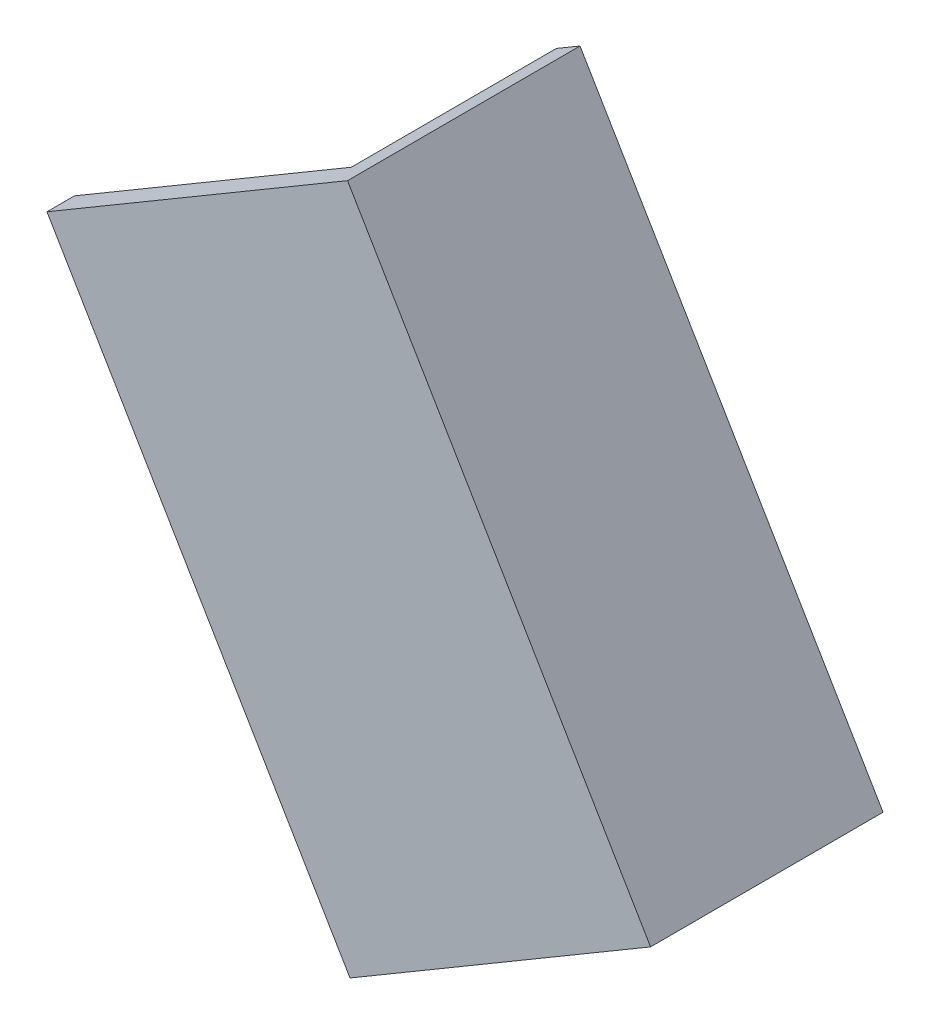
ISO-10303-21;
HEADER;
FILE_DESCRIPTION(('STEP AP214'),'2;1');
FILE_NAME('part.step','',(''),(''),'','','');
FILE_SCHEMA(('AUTOMOTIVE_DESIGN { 1 0 10303 214 1 1 1 1 }'));
ENDSEC;
DATA;
#1=APPLICATION_CONTEXT('core data for automotive mechanical design processes');
#2=APPLICATION_PROTOCOL_DEFINITION('international standard','automotive_design',2000,#1);
#3=PRODUCT_CONTEXT('',#1,'mechanical');
#4=PRODUCT('Part','Part','',(#3));
#5=PRODUCT_RELATED_PRODUCT_CATEGORY('part','',(#4));
#6=PRODUCT_DEFINITION_FORMATION('','',#4);
#7=PRODUCT_DEFINITION_CONTEXT('part definition',#1,'design');
#8=PRODUCT_DEFINITION('design','',#6,#7);
#9=PRODUCT_DEFINITION_SHAPE('','',#8);
#10=(LENGTH_UNIT() NAMED_UNIT(*) SI_UNIT(.MILLI.,.METRE.));
#11=(NAMED_UNIT(*) PLANE_ANGLE_UNIT() SI_UNIT($,.RADIAN.));
#12=(NAMED_UNIT(*) SI_UNIT($,.STERADIAN.) SOLID_ANGLE_UNIT());
#13=UNCERTAINTY_MEASURE_WITH_UNIT(LENGTH_MEASURE(1.E-05),#10,'distance_accuracy_value','');
#14=(GEOMETRIC_REPRESENTATION_CONTEXT(3) GLOBAL_UNCERTAINTY_ASSIGNED_CONTEXT((#13)) GLOBAL_UNIT_ASSIGNED_CONTEXT((#10,
#11,#12)) REPRESENTATION_CONTEXT('',''));
#15=CARTESIAN_POINT('',(0.,0.,0.));
#16=DIRECTION('',(0.,0.,1.));
#17=DIRECTION('',(1.,0.,0.));
#18=AXIS2_PLACEMENT_3D('',#15,#16,#17);
#19=CARTESIAN_POINT('',(-36.143775133685,308.354359894138,19.2600037848698));
#20=DIRECTION('',(-0.507864835919955,0.861435891425881,0.00123020294821421));
#21=DIRECTION('',(0.000624777289589086,-0.00105974177619298,0.999999243300067));
#22=AXIS2_PLACEMENT_3D('',#19,#20,#21);
#23=PLANE('',#22);
#24=DIRECTION('',(0.000624777289578067,-0.00105974177619944,0.999999243300067));
#25=VECTOR('',#24,1.);
#26=CARTESIAN_POINT('',(-52.5480809433623,298.669247953689,28.9599964448444));
#27=LINE('',#26,#25);
#28=CARTESIAN_POINT('',(-52.5480809433623,298.669247953689,28.9599964448444));
#29=VERTEX_POINT('',#28);
#30=CARTESIAN_POINT('',(-52.5462066114936,298.66606872836,31.9599941747446));
#31=VERTEX_POINT('',#30);
#32=EDGE_CURVE('E11',#29,#31,#27,.T.);
#33=ORIENTED_EDGE('',*,*,#32,.F.);
#34=DIRECTION('',(-0.861436543274858,-0.507865220221532,-1.89672379022703E-12));
#35=VECTOR('',#34,1.);
#36=CARTESIAN_POINT('',(-19.72734864459,318.018912844129,28.9599964449167));
#37=LINE('',#36,#35);
#38=CARTESIAN_POINT('',(-22.3116582744145,316.495317183464,28.959996444911));
#39=VERTEX_POINT('',#38);
#40=EDGE_CURVE('E163',#39,#29,#37,.T.);
#41=ORIENTED_EDGE('',*,*,#40,.F.);
#42=DIRECTION('',(0.000624777289578067,-0.00105974177619944,0.999999243300067));
#43=VECTOR('',#42,1.);
#44=CARTESIAN_POINT('',(-22.325653285701,316.519055399251,6.56001339498947));
#45=LINE('',#44,#43);
#46=CARTESIAN_POINT('',(-22.325653285701,316.519055399251,6.56001339498946));
#47=VERTEX_POINT('',#46);
#48=EDGE_CURVE('E138',#47,#39,#45,.T.);
#49=ORIENTED_EDGE('',*,*,#48,.F.);
#50=DIRECTION('',(-0.861436543274858,-0.507865220221532,-1.89672379022703E-12));
#51=VECTOR('',#50,1.);
#52=CARTESIAN_POINT('',(-19.7413436558766,318.042651059916,6.56001339499516));
#53=LINE('',#52,#51);
#54=CARTESIAN_POINT('',(-19.7413436558766,318.042651059916,6.56001339499516));
#55=VERTEX_POINT('',#54);
#56=EDGE_CURVE('E136',#55,#47,#53,.T.);
#57=ORIENTED_EDGE('',*,*,#56,.F.);
#58=DIRECTION('',(-0.000624777289578067,0.00105974177619944,-0.999999243300067));
#59=VECTOR('',#58,1.);
#60=CARTESIAN_POINT('',(-19.7254743127213,318.0157336188,31.9599941748169));
#61=LINE('',#60,#59);
#62=CARTESIAN_POINT('',(-19.7254743127213,318.0157336188,31.9599941748169));
#63=VERTEX_POINT('',#62);
#64=EDGE_CURVE('E124',#63,#55,#61,.T.);
#65=ORIENTED_EDGE('',*,*,#64,.F.);
#66=DIRECTION('',(0.861436543274858,0.507865220221532,1.89672379022703E-12));
#67=VECTOR('',#66,1.);
#68=CARTESIAN_POINT('',(-52.5462066114936,298.66606872836,31.9599941747446));
#69=LINE('',#68,#67);
#70=EDGE_CURVE('E110',#31,#63,#69,.T.);
#71=ORIENTED_EDGE('',*,*,#70,.F.);
#72=EDGE_LOOP('',(#33,#41,#49,#57,#65,#71));
#73=FACE_BOUND('',#72,.T.);
#74=ADVANCED_FACE('F49',(#73),#23,.F.);
#75=CARTESIAN_POINT('',(-69.154989468482,364.34769283682,19.3399669765037));
#76=DIRECTION('',(0.507864835919955,-0.861435891425881,-0.00123020294821418));
#77=DIRECTION('',(0.861436543274857,0.507865220221532,1.53499219518328E-12));
#78=AXIS2_PLACEMENT_3D('',#75,#76,#77);
#79=PLANE('',#78);
#80=DIRECTION('',(0.000624777289578067,-0.00105974177619944,0.999999243300067));
#81=VECTOR('',#80,1.);
#82=CARTESIAN_POINT('',(-85.5592952781593,354.662580896371,29.0399596364783));
#83=LINE('',#82,#81);
#84=CARTESIAN_POINT('',(-85.5592952781593,354.662580896371,29.0399596364783));
#85=VERTEX_POINT('',#84);
#86=CARTESIAN_POINT('',(-85.5574209462906,354.659401671042,32.0399573663785));
#87=VERTEX_POINT('',#86);
#88=EDGE_CURVE('E60',#85,#87,#83,.T.);
#89=ORIENTED_EDGE('',*,*,#88,.T.);
#90=DIRECTION('',(0.861436543274858,0.507865220221532,1.89672379022703E-12));
#91=VECTOR('',#90,1.);
#92=CARTESIAN_POINT('',(-85.5574209462906,354.659401671042,32.0399573663785));
#93=LINE('',#92,#91);
#94=CARTESIAN_POINT('',(-52.7366886475184,374.009066561482,32.0399573664508));
#95=VERTEX_POINT('',#94);
#96=EDGE_CURVE('E117',#87,#95,#93,.T.);
#97=ORIENTED_EDGE('',*,*,#96,.T.);
#98=DIRECTION('',(-0.000624777289578067,0.00105974177619944,-0.999999243300067));
#99=VECTOR('',#98,1.);
#100=CARTESIAN_POINT('',(-52.7366886475184,374.009066561482,32.0399573664508));
#101=LINE('',#100,#99);
#102=CARTESIAN_POINT('',(-52.7525579906736,374.035984002598,6.63997658662909));
#103=VERTEX_POINT('',#102);
#104=EDGE_CURVE('E143',#95,#103,#101,.T.);
#105=ORIENTED_EDGE('',*,*,#104,.T.);
#106=DIRECTION('',(-0.861436543274858,-0.507865220221532,-1.89672379022703E-12));
#107=VECTOR('',#106,1.);
#108=CARTESIAN_POINT('',(-52.7525579906736,374.035984002598,6.63997658662909));
#109=LINE('',#108,#107);
#110=CARTESIAN_POINT('',(-55.3368676204985,372.512388341934,6.6399765866234));
#111=VERTEX_POINT('',#110);
#112=EDGE_CURVE('E146',#103,#111,#109,.T.);
#113=ORIENTED_EDGE('',*,*,#112,.T.);
#114=DIRECTION('',(0.000624777289578067,-0.00105974177619944,0.999999243300067));
#115=VECTOR('',#114,1.);
#116=CARTESIAN_POINT('',(-55.3368676204985,372.512388341934,6.6399765866234));
#117=LINE('',#116,#115);
#118=CARTESIAN_POINT('',(-55.322872609212,372.488650126147,29.0399596365449));
#119=VERTEX_POINT('',#118);
#120=EDGE_CURVE('E159',#111,#119,#117,.T.);
#121=ORIENTED_EDGE('',*,*,#120,.T.);
#122=DIRECTION('',(-0.861436543274858,-0.507865220221532,-1.89672379022703E-12));
#123=VECTOR('',#122,1.);
#124=CARTESIAN_POINT('',(-52.738562979387,374.012245786811,29.0399596365506));
#125=LINE('',#124,#123);
#126=EDGE_CURVE('E164',#119,#85,#125,.T.);
#127=ORIENTED_EDGE('',*,*,#126,.T.);
#128=EDGE_LOOP('',(#89,#97,#105,#113,#121,#127));
#129=FACE_BOUND('',#128,.T.);
#130=ADVANCED_FACE('F51',(#129),#79,.F.);
#131=CARTESIAN_POINT('',(-85.5592952781593,354.662580896371,29.0399596364783));
#132=DIRECTION('',(0.861436543274857,0.507865220221531,1.89672382961406E-12));
#133=DIRECTION('',(-0.000624777289578067,0.00105974177619944,-0.999999243300067));
#134=AXIS2_PLACEMENT_3D('',#131,#132,#133);
#135=PLANE('',#134);
#136=ORIENTED_EDGE('',*,*,#88,.F.);
#137=DIRECTION('',(0.507864835919956,-0.861435891425882,-0.00123020294821421));
#138=VECTOR('',#137,1.);
#139=CARTESIAN_POINT('',(-85.5592952781593,354.662580896371,29.0399596364783));
#140=LINE('',#139,#138);
#141=EDGE_CURVE('E53',#85,#29,#140,.T.);
#142=ORIENTED_EDGE('',*,*,#141,.T.);
#143=ORIENTED_EDGE('',*,*,#32,.T.);
#144=DIRECTION('',(0.507864835919956,-0.861435891425882,-0.00123020294821421));
#145=VECTOR('',#144,1.);
#146=CARTESIAN_POINT('',(-85.5574209462906,354.659401671042,32.0399573663785));
#147=LINE('',#146,#145);
#148=EDGE_CURVE('E168',#87,#31,#147,.T.);
#149=ORIENTED_EDGE('',*,*,#148,.F.);
#150=EDGE_LOOP('',(#136,#142,#143,#149));
#151=FACE_BOUND('',#150,.T.);
#152=ADVANCED_FACE('F289',(#151),#135,.F.);
#153=CARTESIAN_POINT('',(-85.5574209462906,354.659401671042,32.0399573663785));
#154=DIRECTION('',(-0.000624777289578081,0.00105974177619947,-0.999999243300067));
#155=DIRECTION('',(-0.862528314570701,-0.506008800868924,2.64943916126762E-06));
#156=AXIS2_PLACEMENT_3D('',#153,#154,#155);
#157=PLANE('',#156);
#158=ORIENTED_EDGE('',*,*,#96,.F.);
#159=ORIENTED_EDGE('',*,*,#148,.T.);
#160=ORIENTED_EDGE('',*,*,#70,.T.);
#161=DIRECTION('',(0.507864835919956,-0.861435891425882,-0.00123020294821421));
#162=VECTOR('',#161,1.);
#163=CARTESIAN_POINT('',(-52.7366886475184,374.009066561482,32.0399573664508));
#164=LINE('',#163,#162);
#165=EDGE_CURVE('E131',#95,#63,#164,.T.);
#166=ORIENTED_EDGE('',*,*,#165,.F.);
#167=EDGE_LOOP('',(#158,#159,#160,#166));
#168=FACE_BOUND('',#167,.T.);
#169=ADVANCED_FACE('F203',(#168),#157,.F.);
#170=CARTESIAN_POINT('',(-52.7366886475184,374.009066561482,32.0399573664508));
#171=DIRECTION('',(-0.861436543274857,-0.507865220221531,-1.89672382961406E-12));
#172=DIRECTION('',(0.000624777374879913,-0.00105974192088769,0.99999924329986));
#173=AXIS2_PLACEMENT_3D('',#170,#171,#172);
#174=PLANE('',#173);
#175=ORIENTED_EDGE('',*,*,#104,.F.);
#176=ORIENTED_EDGE('',*,*,#165,.T.);
#177=ORIENTED_EDGE('',*,*,#64,.T.);
#178=DIRECTION('',(0.507864835919956,-0.861435891425882,-0.00123020294821421));
#179=VECTOR('',#178,1.);
#180=CARTESIAN_POINT('',(-52.7525579906736,374.035984002598,6.63997658662909));
#181=LINE('',#180,#179);
#182=EDGE_CURVE('E129',#103,#55,#181,.T.);
#183=ORIENTED_EDGE('',*,*,#182,.F.);
#184=EDGE_LOOP('',(#175,#176,#177,#183));
#185=FACE_BOUND('',#184,.T.);
#186=ADVANCED_FACE('F127',(#185),#174,.F.);
#187=CARTESIAN_POINT('',(-52.7525579906736,374.035984002598,6.63997658662909));
#188=DIRECTION('',(0.000624777289578081,-0.00105974177619947,0.999999243300067));
#189=DIRECTION('',(0.506008415164377,-0.862527663550892,-0.00123020009521503));
#190=AXIS2_PLACEMENT_3D('',#187,#188,#189);
#191=PLANE('',#190);
#192=ORIENTED_EDGE('',*,*,#112,.F.);
#193=ORIENTED_EDGE('',*,*,#182,.T.);
#194=ORIENTED_EDGE('',*,*,#56,.T.);
#195=DIRECTION('',(0.507864835919956,-0.861435891425882,-0.00123020294821421));
#196=VECTOR('',#195,1.);
#197=CARTESIAN_POINT('',(-55.3368676204985,372.512388341934,6.6399765866234));
#198=LINE('',#197,#196);
#199=EDGE_CURVE('E156',#111,#47,#198,.T.);
#200=ORIENTED_EDGE('',*,*,#199,.F.);
#201=EDGE_LOOP('',(#192,#193,#194,#200));
#202=FACE_BOUND('',#201,.T.);
#203=ADVANCED_FACE('F145',(#202),#191,.F.);
#204=CARTESIAN_POINT('',(-55.3368676204985,372.512388341934,6.6399765866234));
#205=DIRECTION('',(0.861436543274857,0.507865220221531,1.89672382961406E-12));
#206=DIRECTION('',(-0.000624777289578067,0.00105974177619944,-0.999999243300067));
#207=AXIS2_PLACEMENT_3D('',#204,#205,#206);
#208=PLANE('',#207);
#209=ORIENTED_EDGE('',*,*,#120,.F.);
#210=ORIENTED_EDGE('',*,*,#199,.T.);
#211=ORIENTED_EDGE('',*,*,#48,.T.);
#212=DIRECTION('',(0.507864835919956,-0.861435891425882,-0.00123020294821421));
#213=VECTOR('',#212,1.);
#214=CARTESIAN_POINT('',(-55.322872609212,372.488650126147,29.0399596365449));
#215=LINE('',#214,#213);
#216=EDGE_CURVE('E160',#119,#39,#215,.T.);
#217=ORIENTED_EDGE('',*,*,#216,.F.);
#218=EDGE_LOOP('',(#209,#210,#211,#217));
#219=FACE_BOUND('',#218,.T.);
#220=ADVANCED_FACE('F202',(#219),#208,.F.);
#221=CARTESIAN_POINT('',(-55.322872609212,372.488650126147,29.0399596365449));
#222=DIRECTION('',(0.000624777289578081,-0.00105974177619947,0.999999243300067));
#223=DIRECTION('',(0.506008415164377,-0.862527663550892,-0.00123020009521503));
#224=AXIS2_PLACEMENT_3D('',#221,#222,#223);
#225=PLANE('',#224);
#226=ORIENTED_EDGE('',*,*,#126,.F.);
#227=ORIENTED_EDGE('',*,*,#216,.T.);
#228=ORIENTED_EDGE('',*,*,#40,.T.);
#229=ORIENTED_EDGE('',*,*,#141,.F.);
#230=EDGE_LOOP('',(#226,#227,#228,#229));
#231=FACE_BOUND('',#230,.T.);
#232=ADVANCED_FACE('F180',(#231),#225,.F.);
#233=CLOSED_SHELL('',(#74,#130,#152,#169,#186,#203,#220,#232));
#234=MANIFOLD_SOLID_BREP('B2',#233);
#235=ADVANCED_BREP_SHAPE_REPRESENTATION('',(#18,#234),#14);
#236=SHAPE_DEFINITION_REPRESENTATION(#9,#235);
ENDSEC;
END-ISO-10303-21;
